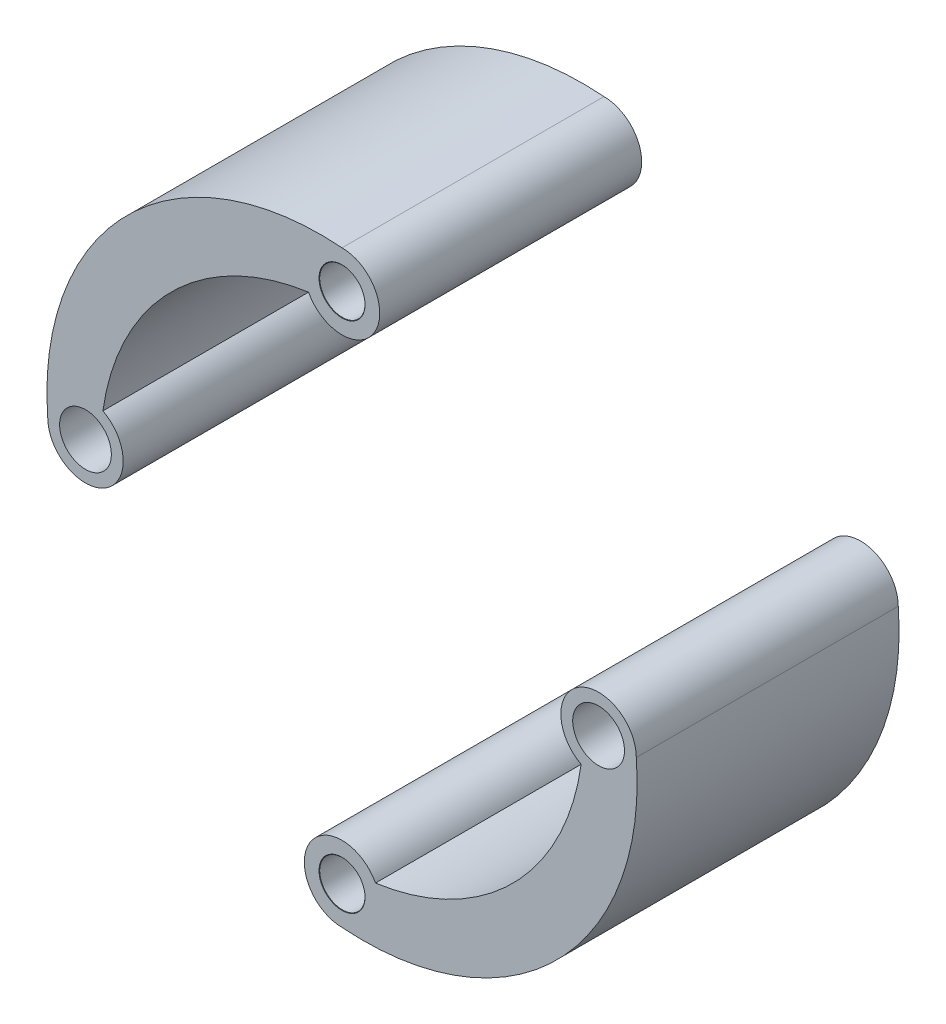
ISO-10303-21;
HEADER;
FILE_DESCRIPTION(('STEP AP214'),'2;1');
FILE_NAME('part.step','',(''),(''),'','','');
FILE_SCHEMA(('AUTOMOTIVE_DESIGN { 1 0 10303 214 1 1 1 1 }'));
ENDSEC;
DATA;
#1=APPLICATION_CONTEXT('core data for automotive mechanical design processes');
#2=APPLICATION_PROTOCOL_DEFINITION('international standard','automotive_design',2000,#1);
#3=PRODUCT_CONTEXT('',#1,'mechanical');
#4=PRODUCT('Part','Part','',(#3));
#5=PRODUCT_RELATED_PRODUCT_CATEGORY('part','',(#4));
#6=PRODUCT_DEFINITION_FORMATION('','',#4);
#7=PRODUCT_DEFINITION_CONTEXT('part definition',#1,'design');
#8=PRODUCT_DEFINITION('design','',#6,#7);
#9=PRODUCT_DEFINITION_SHAPE('','',#8);
#10=(LENGTH_UNIT() NAMED_UNIT(*) SI_UNIT(.MILLI.,.METRE.));
#11=(NAMED_UNIT(*) PLANE_ANGLE_UNIT() SI_UNIT($,.RADIAN.));
#12=(NAMED_UNIT(*) SI_UNIT($,.STERADIAN.) SOLID_ANGLE_UNIT());
#13=UNCERTAINTY_MEASURE_WITH_UNIT(LENGTH_MEASURE(1.E-05),#10,'distance_accuracy_value','');
#14=(GEOMETRIC_REPRESENTATION_CONTEXT(3) GLOBAL_UNCERTAINTY_ASSIGNED_CONTEXT((#13)) GLOBAL_UNIT_ASSIGNED_CONTEXT((#10,
#11,#12)) REPRESENTATION_CONTEXT('',''));
#15=CARTESIAN_POINT('',(0.,0.,0.));
#16=DIRECTION('',(0.,0.,1.));
#17=DIRECTION('',(1.,0.,0.));
#18=AXIS2_PLACEMENT_3D('',#15,#16,#17);
#19=CARTESIAN_POINT('',(0.,-17.,17.3574));
#20=DIRECTION('',(0.,0.,-1.));
#21=DIRECTION('',(-1.,0.,0.));
#22=AXIS2_PLACEMENT_3D('',#19,#20,#21);
#23=CYLINDRICAL_SURFACE('',#22,2.5);
#24=CARTESIAN_POINT('',(0.,-17.,0.));
#25=DIRECTION('',(0.,0.,1.));
#26=DIRECTION('',(1.,0.,0.));
#27=AXIS2_PLACEMENT_3D('',#24,#25,#26);
#28=CIRCLE('',#27,2.5);
#29=CARTESIAN_POINT('',(2.21750613922682,-15.8455882352941,0.));
#30=VERTEX_POINT('',#29);
#31=CARTESIAN_POINT('',(0.,-19.5,0.));
#32=VERTEX_POINT('',#31);
#33=EDGE_CURVE('E149',#30,#32,#28,.T.);
#34=ORIENTED_EDGE('',*,*,#33,.T.);
#35=DIRECTION('',(0.,0.,-1.));
#36=VECTOR('',#35,1.);
#37=CARTESIAN_POINT('',(0.,-19.5,17.3574));
#38=LINE('',#37,#36);
#39=CARTESIAN_POINT('',(0.,-19.5,17.3574));
#40=VERTEX_POINT('',#39);
#41=EDGE_CURVE('E13',#40,#32,#38,.T.);
#42=ORIENTED_EDGE('',*,*,#41,.F.);
#43=CARTESIAN_POINT('',(0.,-17.,17.3574));
#44=DIRECTION('',(0.,0.,1.));
#45=DIRECTION('',(1.,0.,0.));
#46=AXIS2_PLACEMENT_3D('',#43,#44,#45);
#47=CIRCLE('',#46,2.5);
#48=CARTESIAN_POINT('',(2.21750613922682,-15.8455882352941,17.3574));
#49=VERTEX_POINT('',#48);
#50=EDGE_CURVE('E133',#49,#40,#47,.T.);
#51=ORIENTED_EDGE('',*,*,#50,.F.);
#52=DIRECTION('',(0.,0.,-1.));
#53=VECTOR('',#52,1.);
#54=CARTESIAN_POINT('',(2.21750613922682,-15.8455882352941,17.3574));
#55=LINE('',#54,#53);
#56=EDGE_CURVE('E145',#49,#30,#55,.T.);
#57=ORIENTED_EDGE('',*,*,#56,.T.);
#58=EDGE_LOOP('',(#34,#42,#51,#57));
#59=FACE_BOUND('',#58,.T.);
#60=ADVANCED_FACE('F81',(#59),#23,.T.);
#61=CARTESIAN_POINT('',(1.4142135623731,-1.41421356237309,17.3574));
#62=DIRECTION('',(0.,0.,-1.));
#63=DIRECTION('',(-1.,0.,0.));
#64=AXIS2_PLACEMENT_3D('',#61,#62,#63);
#65=CYLINDRICAL_SURFACE('',#64,18.1409942138641);
#66=CARTESIAN_POINT('',(1.4142135623731,-1.41421356237309,0.));
#67=DIRECTION('',(0.,0.,1.));
#68=DIRECTION('',(1.,0.,0.));
#69=AXIS2_PLACEMENT_3D('',#66,#67,#68);
#70=CIRCLE('',#69,18.1409942138641);
#71=CARTESIAN_POINT('',(19.5,0.,0.));
#72=VERTEX_POINT('',#71);
#73=EDGE_CURVE('E138',#32,#72,#70,.T.);
#74=ORIENTED_EDGE('',*,*,#73,.T.);
#75=DIRECTION('',(0.,0.,-1.));
#76=VECTOR('',#75,1.);
#77=CARTESIAN_POINT('',(19.5,0.,17.3574));
#78=LINE('',#77,#76);
#79=CARTESIAN_POINT('',(19.5,0.,17.3574));
#80=VERTEX_POINT('',#79);
#81=EDGE_CURVE('E90',#80,#72,#78,.T.);
#82=ORIENTED_EDGE('',*,*,#81,.F.);
#83=CARTESIAN_POINT('',(1.4142135623731,-1.41421356237309,17.3574));
#84=DIRECTION('',(0.,0.,1.));
#85=DIRECTION('',(1.,0.,0.));
#86=AXIS2_PLACEMENT_3D('',#83,#84,#85);
#87=CIRCLE('',#86,18.1409942138641);
#88=EDGE_CURVE('E128',#40,#80,#87,.T.);
#89=ORIENTED_EDGE('',*,*,#88,.F.);
#90=ORIENTED_EDGE('',*,*,#41,.T.);
#91=EDGE_LOOP('',(#74,#82,#89,#90));
#92=FACE_BOUND('',#91,.T.);
#93=ADVANCED_FACE('F137',(#92),#65,.T.);
#94=CARTESIAN_POINT('',(17.,0.,17.3574));
#95=DIRECTION('',(0.,0.,-1.));
#96=DIRECTION('',(-1.,0.,0.));
#97=AXIS2_PLACEMENT_3D('',#94,#95,#96);
#98=CYLINDRICAL_SURFACE('',#97,2.5);
#99=CARTESIAN_POINT('',(17.,0.,0.));
#100=DIRECTION('',(0.,0.,1.));
#101=DIRECTION('',(1.,0.,0.));
#102=AXIS2_PLACEMENT_3D('',#99,#100,#101);
#103=CIRCLE('',#102,2.5);
#104=CARTESIAN_POINT('',(15.8455882352941,-2.21750613922682,0.));
#105=VERTEX_POINT('',#104);
#106=EDGE_CURVE('E115',#72,#105,#103,.T.);
#107=ORIENTED_EDGE('',*,*,#106,.T.);
#108=DIRECTION('',(0.,0.,-1.));
#109=VECTOR('',#108,1.);
#110=CARTESIAN_POINT('',(15.8455882352941,-2.21750613922682,17.3574));
#111=LINE('',#110,#109);
#112=CARTESIAN_POINT('',(15.8455882352941,-2.21750613922682,17.3574));
#113=VERTEX_POINT('',#112);
#114=EDGE_CURVE('E140',#113,#105,#111,.T.);
#115=ORIENTED_EDGE('',*,*,#114,.F.);
#116=CARTESIAN_POINT('',(17.,0.,17.3574));
#117=DIRECTION('',(0.,0.,1.));
#118=DIRECTION('',(1.,0.,0.));
#119=AXIS2_PLACEMENT_3D('',#116,#117,#118);
#120=CIRCLE('',#119,2.5);
#121=EDGE_CURVE('E131',#80,#113,#120,.T.);
#122=ORIENTED_EDGE('',*,*,#121,.F.);
#123=ORIENTED_EDGE('',*,*,#81,.T.);
#124=EDGE_LOOP('',(#107,#115,#122,#123));
#125=FACE_BOUND('',#124,.T.);
#126=ADVANCED_FACE('F141',(#125),#98,.T.);
#127=CARTESIAN_POINT('',(0.,0.,17.3574));
#128=DIRECTION('',(0.,0.,-1.));
#129=DIRECTION('',(-1.,0.,0.));
#130=AXIS2_PLACEMENT_3D('',#127,#128,#129);
#131=CYLINDRICAL_SURFACE('',#130,16.);
#132=CARTESIAN_POINT('',(0.,0.,0.));
#133=DIRECTION('',(0.,0.,1.));
#134=DIRECTION('',(1.,0.,0.));
#135=AXIS2_PLACEMENT_3D('',#132,#133,#134);
#136=CIRCLE('',#135,16.);
#137=EDGE_CURVE('E121',#105,#30,#136,.F.);
#138=ORIENTED_EDGE('',*,*,#137,.T.);
#139=ORIENTED_EDGE('',*,*,#56,.F.);
#140=CARTESIAN_POINT('',(0.,0.,17.3574));
#141=DIRECTION('',(0.,0.,1.));
#142=DIRECTION('',(1.,0.,0.));
#143=AXIS2_PLACEMENT_3D('',#140,#141,#142);
#144=CIRCLE('',#143,16.);
#145=EDGE_CURVE('E98',#113,#49,#144,.F.);
#146=ORIENTED_EDGE('',*,*,#145,.F.);
#147=ORIENTED_EDGE('',*,*,#114,.T.);
#148=EDGE_LOOP('',(#138,#139,#146,#147));
#149=FACE_BOUND('',#148,.T.);
#150=ADVANCED_FACE('F163',(#149),#131,.F.);
#151=CARTESIAN_POINT('',(0.,0.,17.3574));
#152=DIRECTION('',(0.,0.,1.));
#153=DIRECTION('',(1.,0.,0.));
#154=AXIS2_PLACEMENT_3D('',#151,#152,#153);
#155=PLANE('',#154);
#156=CARTESIAN_POINT('',(17.,0.,17.3574));
#157=DIRECTION('',(0.,0.,1.));
#158=DIRECTION('',(1.,0.,0.));
#159=AXIS2_PLACEMENT_3D('',#156,#157,#158);
#160=CIRCLE('',#159,1.715);
#161=CARTESIAN_POINT('',(18.715,0.,17.3574));
#162=VERTEX_POINT('',#161);
#163=EDGE_CURVE('E181',#162,#162,#160,.T.);
#164=ORIENTED_EDGE('',*,*,#163,.F.);
#165=EDGE_LOOP('',(#164));
#166=FACE_BOUND('',#165,.T.);
#167=CARTESIAN_POINT('',(0.,-17.,17.3574));
#168=DIRECTION('',(0.,0.,1.));
#169=DIRECTION('',(1.,0.,0.));
#170=AXIS2_PLACEMENT_3D('',#167,#168,#169);
#171=CIRCLE('',#170,1.525);
#172=CARTESIAN_POINT('',(1.525,-17.,17.3574));
#173=VERTEX_POINT('',#172);
#174=EDGE_CURVE('E177',#173,#173,#171,.T.);
#175=ORIENTED_EDGE('',*,*,#174,.F.);
#176=EDGE_LOOP('',(#175));
#177=FACE_BOUND('',#176,.T.);
#178=ORIENTED_EDGE('',*,*,#50,.T.);
#179=ORIENTED_EDGE('',*,*,#88,.T.);
#180=ORIENTED_EDGE('',*,*,#121,.T.);
#181=ORIENTED_EDGE('',*,*,#145,.T.);
#182=EDGE_LOOP('',(#178,#179,#180,#181));
#183=FACE_BOUND('',#182,.T.);
#184=ADVANCED_FACE('F129',(#166,#177,#183),#155,.T.);
#185=CARTESIAN_POINT('',(0.,0.,0.));
#186=DIRECTION('',(0.,0.,1.));
#187=DIRECTION('',(1.,0.,0.));
#188=AXIS2_PLACEMENT_3D('',#185,#186,#187);
#189=PLANE('',#188);
#190=CARTESIAN_POINT('',(17.,0.,0.));
#191=DIRECTION('',(0.,0.,-1.));
#192=DIRECTION('',(-1.,0.,0.));
#193=AXIS2_PLACEMENT_3D('',#190,#191,#192);
#194=CIRCLE('',#193,1.715);
#195=CARTESIAN_POINT('',(15.285,0.,0.));
#196=VERTEX_POINT('',#195);
#197=EDGE_CURVE('E186',#196,#196,#194,.T.);
#198=ORIENTED_EDGE('',*,*,#197,.F.);
#199=EDGE_LOOP('',(#198));
#200=FACE_BOUND('',#199,.T.);
#201=CARTESIAN_POINT('',(0.,-17.,0.));
#202=DIRECTION('',(0.,0.,1.));
#203=DIRECTION('',(1.,0.,0.));
#204=AXIS2_PLACEMENT_3D('',#201,#202,#203);
#205=CIRCLE('',#204,1.5);
#206=CARTESIAN_POINT('',(1.5,-17.,0.));
#207=VERTEX_POINT('',#206);
#208=EDGE_CURVE('E153',#207,#207,#205,.T.);
#209=ORIENTED_EDGE('',*,*,#208,.T.);
#210=EDGE_LOOP('',(#209));
#211=FACE_BOUND('',#210,.T.);
#212=ORIENTED_EDGE('',*,*,#33,.F.);
#213=ORIENTED_EDGE('',*,*,#137,.F.);
#214=ORIENTED_EDGE('',*,*,#106,.F.);
#215=ORIENTED_EDGE('',*,*,#73,.F.);
#216=EDGE_LOOP('',(#212,#213,#214,#215));
#217=FACE_BOUND('',#216,.T.);
#218=ADVANCED_FACE('F166',(#200,#211,#217),#189,.F.);
#219=CARTESIAN_POINT('',(0.,-17.,17.3574));
#220=DIRECTION('',(0.,0.,1.));
#221=DIRECTION('',(1.,0.,0.));
#222=AXIS2_PLACEMENT_3D('',#219,#220,#221);
#223=CYLINDRICAL_SURFACE('',#222,1.5);
#224=ORIENTED_EDGE('',*,*,#208,.F.);
#225=EDGE_LOOP('',(#224));
#226=FACE_BOUND('',#225,.T.);
#227=CARTESIAN_POINT('',(0.,-17.,17.3364225092206));
#228=DIRECTION('',(0.,0.,1.));
#229=DIRECTION('',(1.,0.,0.));
#230=AXIS2_PLACEMENT_3D('',#227,#228,#229);
#231=CIRCLE('',#230,1.5);
#232=CARTESIAN_POINT('',(1.5,-17.,17.3364225092206));
#233=VERTEX_POINT('',#232);
#234=EDGE_CURVE('E173',#233,#233,#231,.T.);
#235=ORIENTED_EDGE('',*,*,#234,.T.);
#236=EDGE_LOOP('',(#235));
#237=FACE_BOUND('',#236,.T.);
#238=ADVANCED_FACE('F202',(#226,#237),#223,.F.);
#239=CARTESIAN_POINT('',(0.,-17.,17.3574));
#240=DIRECTION('',(0.,0.,1.));
#241=DIRECTION('',(1.,0.,0.));
#242=AXIS2_PLACEMENT_3D('',#239,#240,#241);
#243=CONICAL_SURFACE('',#242,1.525,0.872664625997111);
#244=ORIENTED_EDGE('',*,*,#234,.F.);
#245=EDGE_LOOP('',(#244));
#246=FACE_BOUND('',#245,.T.);
#247=ORIENTED_EDGE('',*,*,#174,.T.);
#248=EDGE_LOOP('',(#247));
#249=FACE_BOUND('',#248,.T.);
#250=ADVANCED_FACE('F208',(#246,#249),#243,.F.);
#251=CARTESIAN_POINT('',(17.,0.,12.3574));
#252=DIRECTION('',(0.,0.,1.));
#253=DIRECTION('',(1.,0.,0.));
#254=AXIS2_PLACEMENT_3D('',#251,#252,#253);
#255=CYLINDRICAL_SURFACE('',#254,1.715);
#256=CARTESIAN_POINT('',(17.,0.,12.3574));
#257=DIRECTION('',(0.,0.,1.));
#258=DIRECTION('',(1.,0.,0.));
#259=AXIS2_PLACEMENT_3D('',#256,#257,#258);
#260=CIRCLE('',#259,1.715);
#261=CARTESIAN_POINT('',(18.715,0.,12.3574));
#262=VERTEX_POINT('',#261);
#263=EDGE_CURVE('E182',#262,#262,#260,.T.);
#264=ORIENTED_EDGE('',*,*,#263,.F.);
#265=EDGE_LOOP('',(#264));
#266=FACE_BOUND('',#265,.T.);
#267=ORIENTED_EDGE('',*,*,#163,.T.);
#268=EDGE_LOOP('',(#267));
#269=FACE_BOUND('',#268,.T.);
#270=ADVANCED_FACE('F214',(#266,#269),#255,.F.);
#271=CARTESIAN_POINT('',(17.,0.,12.3574));
#272=DIRECTION('',(0.,0.,1.));
#273=DIRECTION('',(1.,0.,0.));
#274=AXIS2_PLACEMENT_3D('',#271,#272,#273);
#275=PLANE('',#274);
#276=ORIENTED_EDGE('',*,*,#263,.T.);
#277=EDGE_LOOP('',(#276));
#278=FACE_BOUND('',#277,.T.);
#279=ADVANCED_FACE('F263',(#278),#275,.T.);
#280=CARTESIAN_POINT('',(17.,0.,5.));
#281=DIRECTION('',(0.,0.,-1.));
#282=DIRECTION('',(-1.,0.,0.));
#283=AXIS2_PLACEMENT_3D('',#280,#281,#282);
#284=CYLINDRICAL_SURFACE('',#283,1.715);
#285=CARTESIAN_POINT('',(17.,0.,5.));
#286=DIRECTION('',(0.,0.,-1.));
#287=DIRECTION('',(-1.,0.,0.));
#288=AXIS2_PLACEMENT_3D('',#285,#286,#287);
#289=CIRCLE('',#288,1.715);
#290=CARTESIAN_POINT('',(15.285,0.,5.));
#291=VERTEX_POINT('',#290);
#292=EDGE_CURVE('E190',#291,#291,#289,.T.);
#293=ORIENTED_EDGE('',*,*,#292,.F.);
#294=EDGE_LOOP('',(#293));
#295=FACE_BOUND('',#294,.T.);
#296=ORIENTED_EDGE('',*,*,#197,.T.);
#297=EDGE_LOOP('',(#296));
#298=FACE_BOUND('',#297,.T.);
#299=ADVANCED_FACE('F198',(#295,#298),#284,.F.);
#300=CARTESIAN_POINT('',(17.,0.,5.));
#301=DIRECTION('',(0.,0.,-1.));
#302=DIRECTION('',(-1.,0.,0.));
#303=AXIS2_PLACEMENT_3D('',#300,#301,#302);
#304=PLANE('',#303);
#305=ORIENTED_EDGE('',*,*,#292,.T.);
#306=EDGE_LOOP('',(#305));
#307=FACE_BOUND('',#306,.T.);
#308=ADVANCED_FACE('F282',(#307),#304,.T.);
#309=CLOSED_SHELL('',(#60,#93,#126,#150,#184,#218,#238,#250,#270,#279,#299,#308));
#310=MANIFOLD_SOLID_BREP('B2',#309);
#311=CARTESIAN_POINT('',(-17.,0.,17.3574));
#312=DIRECTION('',(0.,0.,-1.));
#313=DIRECTION('',(-1.,0.,0.));
#314=AXIS2_PLACEMENT_3D('',#311,#312,#313);
#315=CYLINDRICAL_SURFACE('',#314,2.5);
#316=CARTESIAN_POINT('',(-17.,0.,0.));
#317=DIRECTION('',(0.,0.,1.));
#318=DIRECTION('',(1.,0.,0.));
#319=AXIS2_PLACEMENT_3D('',#316,#317,#318);
#320=CIRCLE('',#319,2.5);
#321=CARTESIAN_POINT('',(-19.5,0.,0.));
#322=VERTEX_POINT('',#321);
#323=CARTESIAN_POINT('',(-15.8455882352941,2.21750613922682,0.));
#324=VERTEX_POINT('',#323);
#325=EDGE_CURVE('E395',#322,#324,#320,.T.);
#326=ORIENTED_EDGE('',*,*,#325,.T.);
#327=DIRECTION('',(0.,0.,-1.));
#328=VECTOR('',#327,1.);
#329=CARTESIAN_POINT('',(-15.8455882352941,2.21750613922682,17.3574));
#330=LINE('',#329,#328);
#331=CARTESIAN_POINT('',(-15.8455882352941,2.21750613922682,17.3574));
#332=VERTEX_POINT('',#331);
#333=EDGE_CURVE('E79',#332,#324,#330,.T.);
#334=ORIENTED_EDGE('',*,*,#333,.F.);
#335=CARTESIAN_POINT('',(-17.,0.,17.3574));
#336=DIRECTION('',(0.,0.,1.));
#337=DIRECTION('',(1.,0.,0.));
#338=AXIS2_PLACEMENT_3D('',#335,#336,#337);
#339=CIRCLE('',#338,2.5);
#340=CARTESIAN_POINT('',(-19.5,0.,17.3574));
#341=VERTEX_POINT('',#340);
#342=EDGE_CURVE('E381',#341,#332,#339,.T.);
#343=ORIENTED_EDGE('',*,*,#342,.F.);
#344=DIRECTION('',(0.,0.,-1.));
#345=VECTOR('',#344,1.);
#346=CARTESIAN_POINT('',(-19.5,0.,17.3574));
#347=LINE('',#346,#345);
#348=EDGE_CURVE('E348',#341,#322,#347,.T.);
#349=ORIENTED_EDGE('',*,*,#348,.T.);
#350=EDGE_LOOP('',(#326,#334,#343,#349));
#351=FACE_BOUND('',#350,.T.);
#352=ADVANCED_FACE('F332',(#351),#315,.T.);
#353=CARTESIAN_POINT('',(0.,0.,17.3574));
#354=DIRECTION('',(0.,0.,-1.));
#355=DIRECTION('',(-1.,0.,0.));
#356=AXIS2_PLACEMENT_3D('',#353,#354,#355);
#357=CYLINDRICAL_SURFACE('',#356,16.);
#358=CARTESIAN_POINT('',(0.,0.,0.));
#359=DIRECTION('',(0.,0.,1.));
#360=DIRECTION('',(1.,0.,0.));
#361=AXIS2_PLACEMENT_3D('',#358,#359,#360);
#362=CIRCLE('',#361,16.);
#363=CARTESIAN_POINT('',(-2.21750613922682,15.8455882352941,0.));
#364=VERTEX_POINT('',#363);
#365=EDGE_CURVE('E386',#324,#364,#362,.F.);
#366=ORIENTED_EDGE('',*,*,#365,.T.);
#367=DIRECTION('',(0.,0.,-1.));
#368=VECTOR('',#367,1.);
#369=CARTESIAN_POINT('',(-2.21750613922682,15.8455882352941,17.3574));
#370=LINE('',#369,#368);
#371=CARTESIAN_POINT('',(-2.21750613922682,15.8455882352941,17.3574));
#372=VERTEX_POINT('',#371);
#373=EDGE_CURVE('E340',#372,#364,#370,.T.);
#374=ORIENTED_EDGE('',*,*,#373,.F.);
#375=CARTESIAN_POINT('',(0.,0.,17.3574));
#376=DIRECTION('',(0.,0.,1.));
#377=DIRECTION('',(1.,0.,0.));
#378=AXIS2_PLACEMENT_3D('',#375,#376,#377);
#379=CIRCLE('',#378,16.);
#380=EDGE_CURVE('E374',#332,#372,#379,.F.);
#381=ORIENTED_EDGE('',*,*,#380,.F.);
#382=ORIENTED_EDGE('',*,*,#333,.T.);
#383=EDGE_LOOP('',(#366,#374,#381,#382));
#384=FACE_BOUND('',#383,.T.);
#385=ADVANCED_FACE('F385',(#384),#357,.F.);
#386=CARTESIAN_POINT('',(0.,17.,17.3574));
#387=DIRECTION('',(0.,0.,-1.));
#388=DIRECTION('',(-1.,0.,0.));
#389=AXIS2_PLACEMENT_3D('',#386,#387,#388);
#390=CYLINDRICAL_SURFACE('',#389,2.5);
#391=CARTESIAN_POINT('',(0.,17.,0.));
#392=DIRECTION('',(0.,0.,1.));
#393=DIRECTION('',(1.,0.,0.));
#394=AXIS2_PLACEMENT_3D('',#391,#392,#393);
#395=CIRCLE('',#394,2.5);
#396=CARTESIAN_POINT('',(0.,19.5,0.));
#397=VERTEX_POINT('',#396);
#398=EDGE_CURVE('E399',#364,#397,#395,.T.);
#399=ORIENTED_EDGE('',*,*,#398,.T.);
#400=DIRECTION('',(0.,0.,-1.));
#401=VECTOR('',#400,1.);
#402=CARTESIAN_POINT('',(0.,19.5,17.3574));
#403=LINE('',#402,#401);
#404=CARTESIAN_POINT('',(0.,19.5,17.3574));
#405=VERTEX_POINT('',#404);
#406=EDGE_CURVE('E363',#405,#397,#403,.T.);
#407=ORIENTED_EDGE('',*,*,#406,.F.);
#408=CARTESIAN_POINT('',(0.,17.,17.3574));
#409=DIRECTION('',(0.,0.,1.));
#410=DIRECTION('',(1.,0.,0.));
#411=AXIS2_PLACEMENT_3D('',#408,#409,#410);
#412=CIRCLE('',#411,2.5);
#413=EDGE_CURVE('E380',#372,#405,#412,.T.);
#414=ORIENTED_EDGE('',*,*,#413,.F.);
#415=ORIENTED_EDGE('',*,*,#373,.T.);
#416=EDGE_LOOP('',(#399,#407,#414,#415));
#417=FACE_BOUND('',#416,.T.);
#418=ADVANCED_FACE('F389',(#417),#390,.T.);
#419=CARTESIAN_POINT('',(-1.41421356237309,1.41421356237309,17.3574));
#420=DIRECTION('',(0.,0.,-1.));
#421=DIRECTION('',(-1.,0.,0.));
#422=AXIS2_PLACEMENT_3D('',#419,#420,#421);
#423=CYLINDRICAL_SURFACE('',#422,18.1409942138641);
#424=CARTESIAN_POINT('',(-1.41421356237309,1.41421356237309,0.));
#425=DIRECTION('',(0.,0.,1.));
#426=DIRECTION('',(1.,0.,0.));
#427=AXIS2_PLACEMENT_3D('',#424,#425,#426);
#428=CIRCLE('',#427,18.1409942138641);
#429=EDGE_CURVE('E401',#322,#397,#428,.F.);
#430=ORIENTED_EDGE('',*,*,#429,.F.);
#431=ORIENTED_EDGE('',*,*,#348,.F.);
#432=CARTESIAN_POINT('',(-1.41421356237309,1.41421356237309,17.3574));
#433=DIRECTION('',(0.,0.,1.));
#434=DIRECTION('',(1.,0.,0.));
#435=AXIS2_PLACEMENT_3D('',#432,#433,#434);
#436=CIRCLE('',#435,18.1409942138641);
#437=EDGE_CURVE('E390',#341,#405,#436,.F.);
#438=ORIENTED_EDGE('',*,*,#437,.T.);
#439=ORIENTED_EDGE('',*,*,#406,.T.);
#440=EDGE_LOOP('',(#430,#431,#438,#439));
#441=FACE_BOUND('',#440,.T.);
#442=ADVANCED_FACE('F443',(#441),#423,.T.);
#443=CARTESIAN_POINT('',(0.,0.,17.3574));
#444=DIRECTION('',(0.,0.,1.));
#445=DIRECTION('',(1.,0.,0.));
#446=AXIS2_PLACEMENT_3D('',#443,#444,#445);
#447=PLANE('',#446);
#448=CARTESIAN_POINT('',(-17.,0.,17.3574));
#449=DIRECTION('',(0.,0.,1.));
#450=DIRECTION('',(1.,0.,0.));
#451=AXIS2_PLACEMENT_3D('',#448,#449,#450);
#452=CIRCLE('',#451,1.715);
#453=CARTESIAN_POINT('',(-15.285,0.,17.3574));
#454=VERTEX_POINT('',#453);
#455=EDGE_CURVE('E416',#454,#454,#452,.T.);
#456=ORIENTED_EDGE('',*,*,#455,.F.);
#457=EDGE_LOOP('',(#456));
#458=FACE_BOUND('',#457,.T.);
#459=CARTESIAN_POINT('',(0.,17.,17.3574));
#460=DIRECTION('',(0.,0.,1.));
#461=DIRECTION('',(1.,0.,0.));
#462=AXIS2_PLACEMENT_3D('',#459,#460,#461);
#463=CIRCLE('',#462,1.525);
#464=CARTESIAN_POINT('',(1.525,17.,17.3574));
#465=VERTEX_POINT('',#464);
#466=EDGE_CURVE('E412',#465,#465,#463,.T.);
#467=ORIENTED_EDGE('',*,*,#466,.F.);
#468=EDGE_LOOP('',(#467));
#469=FACE_BOUND('',#468,.T.);
#470=ORIENTED_EDGE('',*,*,#342,.T.);
#471=ORIENTED_EDGE('',*,*,#380,.T.);
#472=ORIENTED_EDGE('',*,*,#413,.T.);
#473=ORIENTED_EDGE('',*,*,#437,.F.);
#474=EDGE_LOOP('',(#470,#471,#472,#473));
#475=FACE_BOUND('',#474,.T.);
#476=ADVANCED_FACE('F377',(#458,#469,#475),#447,.T.);
#477=CARTESIAN_POINT('',(0.,0.,0.));
#478=DIRECTION('',(0.,0.,1.));
#479=DIRECTION('',(1.,0.,0.));
#480=AXIS2_PLACEMENT_3D('',#477,#478,#479);
#481=PLANE('',#480);
#482=CARTESIAN_POINT('',(-17.,0.,0.));
#483=DIRECTION('',(0.,0.,-1.));
#484=DIRECTION('',(-1.,0.,0.));
#485=AXIS2_PLACEMENT_3D('',#482,#483,#484);
#486=CIRCLE('',#485,1.715);
#487=CARTESIAN_POINT('',(-18.715,0.,0.));
#488=VERTEX_POINT('',#487);
#489=EDGE_CURVE('E422',#488,#488,#486,.T.);
#490=ORIENTED_EDGE('',*,*,#489,.F.);
#491=EDGE_LOOP('',(#490));
#492=FACE_BOUND('',#491,.T.);
#493=CARTESIAN_POINT('',(0.,17.,0.));
#494=DIRECTION('',(0.,0.,1.));
#495=DIRECTION('',(1.,0.,0.));
#496=AXIS2_PLACEMENT_3D('',#493,#494,#495);
#497=CIRCLE('',#496,1.5);
#498=CARTESIAN_POINT('',(1.5,17.,0.));
#499=VERTEX_POINT('',#498);
#500=EDGE_CURVE('E397',#499,#499,#497,.T.);
#501=ORIENTED_EDGE('',*,*,#500,.T.);
#502=EDGE_LOOP('',(#501));
#503=FACE_BOUND('',#502,.T.);
#504=ORIENTED_EDGE('',*,*,#325,.F.);
#505=ORIENTED_EDGE('',*,*,#429,.T.);
#506=ORIENTED_EDGE('',*,*,#398,.F.);
#507=ORIENTED_EDGE('',*,*,#365,.F.);
#508=EDGE_LOOP('',(#504,#505,#506,#507));
#509=FACE_BOUND('',#508,.T.);
#510=ADVANCED_FACE('F437',(#492,#503,#509),#481,.F.);
#511=CARTESIAN_POINT('',(0.,17.,17.3574));
#512=DIRECTION('',(0.,0.,1.));
#513=DIRECTION('',(1.,0.,0.));
#514=AXIS2_PLACEMENT_3D('',#511,#512,#513);
#515=CYLINDRICAL_SURFACE('',#514,1.5);
#516=ORIENTED_EDGE('',*,*,#500,.F.);
#517=EDGE_LOOP('',(#516));
#518=FACE_BOUND('',#517,.T.);
#519=CARTESIAN_POINT('',(0.,17.,17.3364225092206));
#520=DIRECTION('',(0.,0.,1.));
#521=DIRECTION('',(1.,0.,0.));
#522=AXIS2_PLACEMENT_3D('',#519,#520,#521);
#523=CIRCLE('',#522,1.5);
#524=CARTESIAN_POINT('',(1.5,17.,17.3364225092206));
#525=VERTEX_POINT('',#524);
#526=EDGE_CURVE('E409',#525,#525,#523,.T.);
#527=ORIENTED_EDGE('',*,*,#526,.T.);
#528=EDGE_LOOP('',(#527));
#529=FACE_BOUND('',#528,.T.);
#530=ADVANCED_FACE('F440',(#518,#529),#515,.F.);
#531=CARTESIAN_POINT('',(0.,17.,17.3574));
#532=DIRECTION('',(0.,0.,1.));
#533=DIRECTION('',(1.,0.,0.));
#534=AXIS2_PLACEMENT_3D('',#531,#532,#533);
#535=CONICAL_SURFACE('',#534,1.525,0.872664625997111);
#536=ORIENTED_EDGE('',*,*,#526,.F.);
#537=EDGE_LOOP('',(#536));
#538=FACE_BOUND('',#537,.T.);
#539=ORIENTED_EDGE('',*,*,#466,.T.);
#540=EDGE_LOOP('',(#539));
#541=FACE_BOUND('',#540,.T.);
#542=ADVANCED_FACE('F505',(#538,#541),#535,.F.);
#543=CARTESIAN_POINT('',(-17.,0.,12.3574));
#544=DIRECTION('',(0.,0.,1.));
#545=DIRECTION('',(1.,0.,0.));
#546=AXIS2_PLACEMENT_3D('',#543,#544,#545);
#547=CYLINDRICAL_SURFACE('',#546,1.715);
#548=CARTESIAN_POINT('',(-17.,0.,12.3574));
#549=DIRECTION('',(0.,0.,1.));
#550=DIRECTION('',(1.,0.,0.));
#551=AXIS2_PLACEMENT_3D('',#548,#549,#550);
#552=CIRCLE('',#551,1.715);
#553=CARTESIAN_POINT('',(-15.285,0.,12.3574));
#554=VERTEX_POINT('',#553);
#555=EDGE_CURVE('E415',#554,#554,#552,.T.);
#556=ORIENTED_EDGE('',*,*,#555,.F.);
#557=EDGE_LOOP('',(#556));
#558=FACE_BOUND('',#557,.T.);
#559=ORIENTED_EDGE('',*,*,#455,.T.);
#560=EDGE_LOOP('',(#559));
#561=FACE_BOUND('',#560,.T.);
#562=ADVANCED_FACE('F514',(#558,#561),#547,.F.);
#563=CARTESIAN_POINT('',(-17.,0.,12.3574));
#564=DIRECTION('',(0.,0.,1.));
#565=DIRECTION('',(1.,0.,0.));
#566=AXIS2_PLACEMENT_3D('',#563,#564,#565);
#567=PLANE('',#566);
#568=ORIENTED_EDGE('',*,*,#555,.T.);
#569=EDGE_LOOP('',(#568));
#570=FACE_BOUND('',#569,.T.);
#571=ADVANCED_FACE('F433',(#570),#567,.T.);
#572=CARTESIAN_POINT('',(-17.,0.,5.));
#573=DIRECTION('',(0.,0.,-1.));
#574=DIRECTION('',(-1.,0.,0.));
#575=AXIS2_PLACEMENT_3D('',#572,#573,#574);
#576=CYLINDRICAL_SURFACE('',#575,1.715);
#577=CARTESIAN_POINT('',(-17.,0.,5.));
#578=DIRECTION('',(0.,0.,-1.));
#579=DIRECTION('',(-1.,0.,0.));
#580=AXIS2_PLACEMENT_3D('',#577,#578,#579);
#581=CIRCLE('',#580,1.715);
#582=CARTESIAN_POINT('',(-18.715,0.,5.));
#583=VERTEX_POINT('',#582);
#584=EDGE_CURVE('E419',#583,#583,#581,.T.);
#585=ORIENTED_EDGE('',*,*,#584,.F.);
#586=EDGE_LOOP('',(#585));
#587=FACE_BOUND('',#586,.T.);
#588=ORIENTED_EDGE('',*,*,#489,.T.);
#589=EDGE_LOOP('',(#588));
#590=FACE_BOUND('',#589,.T.);
#591=ADVANCED_FACE('F430',(#587,#590),#576,.F.);
#592=CARTESIAN_POINT('',(-17.,0.,5.));
#593=DIRECTION('',(0.,0.,-1.));
#594=DIRECTION('',(-1.,0.,0.));
#595=AXIS2_PLACEMENT_3D('',#592,#593,#594);
#596=PLANE('',#595);
#597=ORIENTED_EDGE('',*,*,#584,.T.);
#598=EDGE_LOOP('',(#597));
#599=FACE_BOUND('',#598,.T.);
#600=ADVANCED_FACE('F428',(#599),#596,.T.);
#601=CLOSED_SHELL('',(#352,#385,#418,#442,#476,#510,#530,#542,#562,#571,#591,#600));
#602=MANIFOLD_SOLID_BREP('B7',#601);
#603=ADVANCED_BREP_SHAPE_REPRESENTATION('',(#18,#310,#602),#14);
#604=SHAPE_DEFINITION_REPRESENTATION(#9,#603);
ENDSEC;
END-ISO-10303-21;
